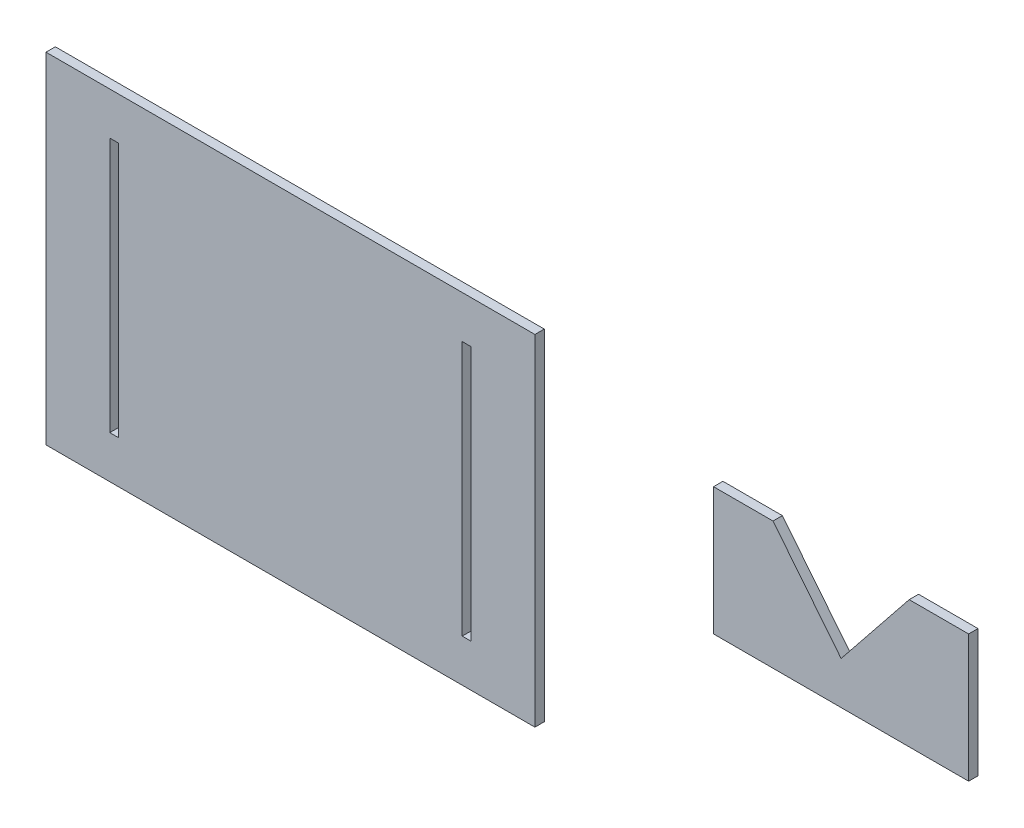
ISO-10303-21;
HEADER;
FILE_DESCRIPTION(('STEP AP214'),'2;1');
FILE_NAME('part.step','',(''),(''),'','','');
FILE_SCHEMA(('AUTOMOTIVE_DESIGN { 1 0 10303 214 1 1 1 1 }'));
ENDSEC;
DATA;
#1=APPLICATION_CONTEXT('core data for automotive mechanical design processes');
#2=APPLICATION_PROTOCOL_DEFINITION('international standard','automotive_design',2000,#1);
#3=PRODUCT_CONTEXT('',#1,'mechanical');
#4=PRODUCT('Part','Part','',(#3));
#5=PRODUCT_RELATED_PRODUCT_CATEGORY('part','',(#4));
#6=PRODUCT_DEFINITION_FORMATION('','',#4);
#7=PRODUCT_DEFINITION_CONTEXT('part definition',#1,'design');
#8=PRODUCT_DEFINITION('design','',#6,#7);
#9=PRODUCT_DEFINITION_SHAPE('','',#8);
#10=(LENGTH_UNIT() NAMED_UNIT(*) SI_UNIT(.MILLI.,.METRE.));
#11=(NAMED_UNIT(*) PLANE_ANGLE_UNIT() SI_UNIT($,.RADIAN.));
#12=(NAMED_UNIT(*) SI_UNIT($,.STERADIAN.) SOLID_ANGLE_UNIT());
#13=UNCERTAINTY_MEASURE_WITH_UNIT(LENGTH_MEASURE(1.E-05),#10,'distance_accuracy_value','');
#14=(GEOMETRIC_REPRESENTATION_CONTEXT(3) GLOBAL_UNCERTAINTY_ASSIGNED_CONTEXT((#13)) GLOBAL_UNIT_ASSIGNED_CONTEXT((#10,
#11,#12)) REPRESENTATION_CONTEXT('',''));
#15=CARTESIAN_POINT('',(0.,0.,0.));
#16=DIRECTION('',(0.,0.,1.));
#17=DIRECTION('',(1.,0.,0.));
#18=AXIS2_PLACEMENT_3D('',#15,#16,#17);
#19=CARTESIAN_POINT('',(159.51855249135,0.,2.2));
#20=DIRECTION('',(-1.,0.,0.));
#21=DIRECTION('',(0.,0.,1.));
#22=AXIS2_PLACEMENT_3D('',#19,#20,#21);
#23=PLANE('',#22);
#24=DIRECTION('',(0.,1.,0.));
#25=VECTOR('',#24,1.);
#26=CARTESIAN_POINT('',(159.51855249135,0.,0.));
#27=LINE('',#26,#25);
#28=CARTESIAN_POINT('',(159.51855249135,0.,0.));
#29=VERTEX_POINT('',#28);
#30=CARTESIAN_POINT('',(159.51855249135,30.,0.));
#31=VERTEX_POINT('',#30);
#32=EDGE_CURVE('E133',#29,#31,#27,.T.);
#33=ORIENTED_EDGE('',*,*,#32,.T.);
#34=DIRECTION('',(0.,0.,-1.));
#35=VECTOR('',#34,1.);
#36=CARTESIAN_POINT('',(159.51855249135,30.,2.2));
#37=LINE('',#36,#35);
#38=CARTESIAN_POINT('',(159.51855249135,30.,2.2));
#39=VERTEX_POINT('',#38);
#40=EDGE_CURVE('E12',#39,#31,#37,.T.);
#41=ORIENTED_EDGE('',*,*,#40,.F.);
#42=DIRECTION('',(0.,1.,0.));
#43=VECTOR('',#42,1.);
#44=CARTESIAN_POINT('',(159.51855249135,0.,2.2));
#45=LINE('',#44,#43);
#46=CARTESIAN_POINT('',(159.51855249135,0.,2.2));
#47=VERTEX_POINT('',#46);
#48=EDGE_CURVE('E145',#47,#39,#45,.T.);
#49=ORIENTED_EDGE('',*,*,#48,.F.);
#50=DIRECTION('',(0.,0.,-1.));
#51=VECTOR('',#50,1.);
#52=CARTESIAN_POINT('',(159.51855249135,0.,2.2));
#53=LINE('',#52,#51);
#54=EDGE_CURVE('E129',#47,#29,#53,.T.);
#55=ORIENTED_EDGE('',*,*,#54,.T.);
#56=EDGE_LOOP('',(#33,#41,#49,#55));
#57=FACE_BOUND('',#56,.T.);
#58=ADVANCED_FACE('F43',(#57),#23,.F.);
#59=CARTESIAN_POINT('',(159.51855249135,30.,2.2));
#60=DIRECTION('',(0.,-1.,0.));
#61=DIRECTION('',(1.,0.,0.));
#62=AXIS2_PLACEMENT_3D('',#59,#60,#61);
#63=PLANE('',#62);
#64=DIRECTION('',(-1.,0.,0.));
#65=VECTOR('',#64,1.);
#66=CARTESIAN_POINT('',(159.51855249135,30.,0.));
#67=LINE('',#66,#65);
#68=CARTESIAN_POINT('',(145.531367871858,30.,0.));
#69=VERTEX_POINT('',#68);
#70=EDGE_CURVE('E136',#31,#69,#67,.T.);
#71=ORIENTED_EDGE('',*,*,#70,.T.);
#72=DIRECTION('',(0.,0.,-1.));
#73=VECTOR('',#72,1.);
#74=CARTESIAN_POINT('',(145.531367871858,30.,2.2));
#75=LINE('',#74,#73);
#76=CARTESIAN_POINT('',(145.531367871858,30.,2.2));
#77=VERTEX_POINT('',#76);
#78=EDGE_CURVE('E51',#77,#69,#75,.T.);
#79=ORIENTED_EDGE('',*,*,#78,.F.);
#80=DIRECTION('',(-1.,0.,0.));
#81=VECTOR('',#80,1.);
#82=CARTESIAN_POINT('',(159.51855249135,30.,2.2));
#83=LINE('',#82,#81);
#84=EDGE_CURVE('E99',#39,#77,#83,.T.);
#85=ORIENTED_EDGE('',*,*,#84,.F.);
#86=ORIENTED_EDGE('',*,*,#40,.T.);
#87=EDGE_LOOP('',(#71,#79,#85,#86));
#88=FACE_BOUND('',#87,.T.);
#89=ADVANCED_FACE('F170',(#88),#63,.F.);
#90=CARTESIAN_POINT('',(129.51855249135,10.,2.2));
#91=DIRECTION('',(0.7806247497998,-0.625,0.));
#92=DIRECTION('',(0.625,0.7806247497998,0.));
#93=AXIS2_PLACEMENT_3D('',#90,#91,#92);
#94=PLANE('',#93);
#95=DIRECTION('',(-0.625,-0.7806247497998,0.));
#96=VECTOR('',#95,1.);
#97=CARTESIAN_POINT('',(129.51855249135,10.,0.));
#98=LINE('',#97,#96);
#99=CARTESIAN_POINT('',(129.51855249135,10.,0.));
#100=VERTEX_POINT('',#99);
#101=EDGE_CURVE('E138',#69,#100,#98,.T.);
#102=ORIENTED_EDGE('',*,*,#101,.T.);
#103=DIRECTION('',(0.,0.,-1.));
#104=VECTOR('',#103,1.);
#105=CARTESIAN_POINT('',(129.51855249135,10.,2.2));
#106=LINE('',#105,#104);
#107=CARTESIAN_POINT('',(129.51855249135,10.,2.2));
#108=VERTEX_POINT('',#107);
#109=EDGE_CURVE('E149',#108,#100,#106,.T.);
#110=ORIENTED_EDGE('',*,*,#109,.F.);
#111=DIRECTION('',(-0.625,-0.7806247497998,0.));
#112=VECTOR('',#111,1.);
#113=CARTESIAN_POINT('',(129.51855249135,10.,2.2));
#114=LINE('',#113,#112);
#115=EDGE_CURVE('E157',#77,#108,#114,.T.);
#116=ORIENTED_EDGE('',*,*,#115,.F.);
#117=ORIENTED_EDGE('',*,*,#78,.T.);
#118=EDGE_LOOP('',(#102,#110,#116,#117));
#119=FACE_BOUND('',#118,.T.);
#120=ADVANCED_FACE('F155',(#119),#94,.F.);
#121=CARTESIAN_POINT('',(113.505737110841,30.,2.2));
#122=DIRECTION('',(-0.7806247497998,-0.625,0.));
#123=DIRECTION('',(0.625,-0.7806247497998,0.));
#124=AXIS2_PLACEMENT_3D('',#121,#122,#123);
#125=PLANE('',#124);
#126=DIRECTION('',(-0.625,0.7806247497998,0.));
#127=VECTOR('',#126,1.);
#128=CARTESIAN_POINT('',(113.505737110841,30.,0.));
#129=LINE('',#128,#127);
#130=CARTESIAN_POINT('',(113.505737110841,30.,0.));
#131=VERTEX_POINT('',#130);
#132=EDGE_CURVE('E140',#100,#131,#129,.T.);
#133=ORIENTED_EDGE('',*,*,#132,.T.);
#134=DIRECTION('',(0.,0.,-1.));
#135=VECTOR('',#134,1.);
#136=CARTESIAN_POINT('',(113.505737110841,30.,2.2));
#137=LINE('',#136,#135);
#138=CARTESIAN_POINT('',(113.505737110841,30.,2.2));
#139=VERTEX_POINT('',#138);
#140=EDGE_CURVE('E124',#139,#131,#137,.T.);
#141=ORIENTED_EDGE('',*,*,#140,.F.);
#142=DIRECTION('',(-0.625,0.7806247497998,0.));
#143=VECTOR('',#142,1.);
#144=CARTESIAN_POINT('',(113.505737110841,30.,2.2));
#145=LINE('',#144,#143);
#146=EDGE_CURVE('E115',#108,#139,#145,.T.);
#147=ORIENTED_EDGE('',*,*,#146,.F.);
#148=ORIENTED_EDGE('',*,*,#109,.T.);
#149=EDGE_LOOP('',(#133,#141,#147,#148));
#150=FACE_BOUND('',#149,.T.);
#151=ADVANCED_FACE('F163',(#150),#125,.F.);
#152=CARTESIAN_POINT('',(113.505737110841,30.,2.2));
#153=DIRECTION('',(0.,-1.,0.));
#154=DIRECTION('',(1.,0.,0.));
#155=AXIS2_PLACEMENT_3D('',#152,#153,#154);
#156=PLANE('',#155);
#157=DIRECTION('',(-1.,0.,0.));
#158=VECTOR('',#157,1.);
#159=CARTESIAN_POINT('',(113.505737110841,30.,0.));
#160=LINE('',#159,#158);
#161=CARTESIAN_POINT('',(99.5185524913497,30.,0.));
#162=VERTEX_POINT('',#161);
#163=EDGE_CURVE('E123',#131,#162,#160,.T.);
#164=ORIENTED_EDGE('',*,*,#163,.T.);
#165=DIRECTION('',(0.,0.,-1.));
#166=VECTOR('',#165,1.);
#167=CARTESIAN_POINT('',(99.5185524913497,30.,2.2));
#168=LINE('',#167,#166);
#169=CARTESIAN_POINT('',(99.5185524913497,30.,2.2));
#170=VERTEX_POINT('',#169);
#171=EDGE_CURVE('E120',#170,#162,#168,.T.);
#172=ORIENTED_EDGE('',*,*,#171,.F.);
#173=DIRECTION('',(-1.,0.,0.));
#174=VECTOR('',#173,1.);
#175=CARTESIAN_POINT('',(113.505737110841,30.,2.2));
#176=LINE('',#175,#174);
#177=EDGE_CURVE('E109',#139,#170,#176,.T.);
#178=ORIENTED_EDGE('',*,*,#177,.F.);
#179=ORIENTED_EDGE('',*,*,#140,.T.);
#180=EDGE_LOOP('',(#164,#172,#178,#179));
#181=FACE_BOUND('',#180,.T.);
#182=ADVANCED_FACE('F121',(#181),#156,.F.);
#183=CARTESIAN_POINT('',(99.5185524913497,0.,2.2));
#184=DIRECTION('',(1.,0.,0.));
#185=DIRECTION('',(0.,0.,-1.));
#186=AXIS2_PLACEMENT_3D('',#183,#184,#185);
#187=PLANE('',#186);
#188=DIRECTION('',(0.,-1.,0.));
#189=VECTOR('',#188,1.);
#190=CARTESIAN_POINT('',(99.5185524913497,0.,0.));
#191=LINE('',#190,#189);
#192=CARTESIAN_POINT('',(99.5185524913497,0.,0.));
#193=VERTEX_POINT('',#192);
#194=EDGE_CURVE('E85',#162,#193,#191,.T.);
#195=ORIENTED_EDGE('',*,*,#194,.T.);
#196=DIRECTION('',(0.,0.,-1.));
#197=VECTOR('',#196,1.);
#198=CARTESIAN_POINT('',(99.5185524913497,0.,2.2));
#199=LINE('',#198,#197);
#200=CARTESIAN_POINT('',(99.5185524913497,0.,2.2));
#201=VERTEX_POINT('',#200);
#202=EDGE_CURVE('E125',#201,#193,#199,.T.);
#203=ORIENTED_EDGE('',*,*,#202,.F.);
#204=DIRECTION('',(0.,-1.,0.));
#205=VECTOR('',#204,1.);
#206=CARTESIAN_POINT('',(99.5185524913497,0.,2.2));
#207=LINE('',#206,#205);
#208=EDGE_CURVE('E113',#170,#201,#207,.T.);
#209=ORIENTED_EDGE('',*,*,#208,.F.);
#210=ORIENTED_EDGE('',*,*,#171,.T.);
#211=EDGE_LOOP('',(#195,#203,#209,#210));
#212=FACE_BOUND('',#211,.T.);
#213=ADVANCED_FACE('F127',(#212),#187,.F.);
#214=CARTESIAN_POINT('',(159.51855249135,0.,2.2));
#215=DIRECTION('',(0.,1.,0.));
#216=DIRECTION('',(-1.,0.,0.));
#217=AXIS2_PLACEMENT_3D('',#214,#215,#216);
#218=PLANE('',#217);
#219=DIRECTION('',(1.,0.,0.));
#220=VECTOR('',#219,1.);
#221=CARTESIAN_POINT('',(159.51855249135,0.,0.));
#222=LINE('',#221,#220);
#223=EDGE_CURVE('E91',#193,#29,#222,.T.);
#224=ORIENTED_EDGE('',*,*,#223,.T.);
#225=ORIENTED_EDGE('',*,*,#54,.F.);
#226=DIRECTION('',(1.,0.,0.));
#227=VECTOR('',#226,1.);
#228=CARTESIAN_POINT('',(159.51855249135,0.,2.2));
#229=LINE('',#228,#227);
#230=EDGE_CURVE('E59',#201,#47,#229,.T.);
#231=ORIENTED_EDGE('',*,*,#230,.F.);
#232=ORIENTED_EDGE('',*,*,#202,.T.);
#233=EDGE_LOOP('',(#224,#225,#231,#232));
#234=FACE_BOUND('',#233,.T.);
#235=ADVANCED_FACE('F184',(#234),#218,.F.);
#236=CARTESIAN_POINT('',(0.,0.,2.2));
#237=DIRECTION('',(0.,0.,1.));
#238=DIRECTION('',(1.,0.,0.));
#239=AXIS2_PLACEMENT_3D('',#236,#237,#238);
#240=PLANE('',#239);
#241=ORIENTED_EDGE('',*,*,#48,.T.);
#242=ORIENTED_EDGE('',*,*,#84,.T.);
#243=ORIENTED_EDGE('',*,*,#115,.T.);
#244=ORIENTED_EDGE('',*,*,#146,.T.);
#245=ORIENTED_EDGE('',*,*,#177,.T.);
#246=ORIENTED_EDGE('',*,*,#208,.T.);
#247=ORIENTED_EDGE('',*,*,#230,.T.);
#248=EDGE_LOOP('',(#241,#242,#243,#244,#245,#246,#247));
#249=FACE_BOUND('',#248,.T.);
#250=ADVANCED_FACE('F111',(#249),#240,.T.);
#251=CARTESIAN_POINT('',(0.,0.,0.));
#252=DIRECTION('',(0.,0.,1.));
#253=DIRECTION('',(1.,0.,0.));
#254=AXIS2_PLACEMENT_3D('',#251,#252,#253);
#255=PLANE('',#254);
#256=ORIENTED_EDGE('',*,*,#32,.F.);
#257=ORIENTED_EDGE('',*,*,#223,.F.);
#258=ORIENTED_EDGE('',*,*,#194,.F.);
#259=ORIENTED_EDGE('',*,*,#163,.F.);
#260=ORIENTED_EDGE('',*,*,#132,.F.);
#261=ORIENTED_EDGE('',*,*,#101,.F.);
#262=ORIENTED_EDGE('',*,*,#70,.F.);
#263=EDGE_LOOP('',(#256,#257,#258,#259,#260,#261,#262));
#264=FACE_BOUND('',#263,.T.);
#265=ADVANCED_FACE('F161',(#264),#255,.F.);
#266=CLOSED_SHELL('',(#58,#89,#120,#151,#182,#213,#235,#250,#265));
#267=MANIFOLD_SOLID_BREP('B2',#266);
#268=CARTESIAN_POINT('',(0.,0.,2.2));
#269=DIRECTION('',(0.,0.,-1.));
#270=DIRECTION('',(-1.,0.,0.));
#271=AXIS2_PLACEMENT_3D('',#268,#269,#270);
#272=PLANE('',#271);
#273=DIRECTION('',(0.,1.,0.));
#274=VECTOR('',#273,1.);
#275=CARTESIAN_POINT('',(42.5,-30.,2.2));
#276=LINE('',#275,#274);
#277=CARTESIAN_POINT('',(42.5,-30.,2.2));
#278=VERTEX_POINT('',#277);
#279=CARTESIAN_POINT('',(42.5,30.,2.2));
#280=VERTEX_POINT('',#279);
#281=EDGE_CURVE('E370',#278,#280,#276,.T.);
#282=ORIENTED_EDGE('',*,*,#281,.F.);
#283=DIRECTION('',(1.,0.,0.));
#284=VECTOR('',#283,1.);
#285=CARTESIAN_POINT('',(40.4,-30.,2.2));
#286=LINE('',#285,#284);
#287=CARTESIAN_POINT('',(40.4,-30.,2.2));
#288=VERTEX_POINT('',#287);
#289=EDGE_CURVE('E378',#288,#278,#286,.T.);
#290=ORIENTED_EDGE('',*,*,#289,.F.);
#291=DIRECTION('',(0.,-1.,0.));
#292=VECTOR('',#291,1.);
#293=CARTESIAN_POINT('',(40.4,-30.,2.2));
#294=LINE('',#293,#292);
#295=CARTESIAN_POINT('',(40.4,30.,2.2));
#296=VERTEX_POINT('',#295);
#297=EDGE_CURVE('E375',#296,#288,#294,.T.);
#298=ORIENTED_EDGE('',*,*,#297,.F.);
#299=DIRECTION('',(-1.,0.,0.));
#300=VECTOR('',#299,1.);
#301=CARTESIAN_POINT('',(40.4,30.,2.2));
#302=LINE('',#301,#300);
#303=EDGE_CURVE('E372',#280,#296,#302,.T.);
#304=ORIENTED_EDGE('',*,*,#303,.F.);
#305=EDGE_LOOP('',(#282,#290,#298,#304));
#306=FACE_BOUND('',#305,.T.);
#307=DIRECTION('',(0.,1.,0.));
#308=VECTOR('',#307,1.);
#309=CARTESIAN_POINT('',(57.5,-40.,2.2));
#310=LINE('',#309,#308);
#311=CARTESIAN_POINT('',(57.5,-40.,2.2));
#312=VERTEX_POINT('',#311);
#313=CARTESIAN_POINT('',(57.5,40.,2.2));
#314=VERTEX_POINT('',#313);
#315=EDGE_CURVE('E401',#312,#314,#310,.T.);
#316=ORIENTED_EDGE('',*,*,#315,.T.);
#317=DIRECTION('',(-1.,0.,0.));
#318=VECTOR('',#317,1.);
#319=CARTESIAN_POINT('',(-57.5,40.,2.2));
#320=LINE('',#319,#318);
#321=CARTESIAN_POINT('',(-57.5,40.,2.2));
#322=VERTEX_POINT('',#321);
#323=EDGE_CURVE('E404',#314,#322,#320,.T.);
#324=ORIENTED_EDGE('',*,*,#323,.T.);
#325=DIRECTION('',(0.,-1.,0.));
#326=VECTOR('',#325,1.);
#327=CARTESIAN_POINT('',(-57.5,-40.,2.2));
#328=LINE('',#327,#326);
#329=CARTESIAN_POINT('',(-57.5,-40.,2.2));
#330=VERTEX_POINT('',#329);
#331=EDGE_CURVE('E407',#322,#330,#328,.T.);
#332=ORIENTED_EDGE('',*,*,#331,.T.);
#333=DIRECTION('',(1.,0.,0.));
#334=VECTOR('',#333,1.);
#335=CARTESIAN_POINT('',(-57.5,-40.,2.2));
#336=LINE('',#335,#334);
#337=EDGE_CURVE('E409',#330,#312,#336,.T.);
#338=ORIENTED_EDGE('',*,*,#337,.T.);
#339=EDGE_LOOP('',(#316,#324,#332,#338));
#340=FACE_BOUND('',#339,.T.);
#341=DIRECTION('',(0.,1.,0.));
#342=VECTOR('',#341,1.);
#343=CARTESIAN_POINT('',(-40.4,-30.,2.2));
#344=LINE('',#343,#342);
#345=CARTESIAN_POINT('',(-40.4,-30.,2.2));
#346=VERTEX_POINT('',#345);
#347=CARTESIAN_POINT('',(-40.4,30.,2.2));
#348=VERTEX_POINT('',#347);
#349=EDGE_CURVE('E334',#346,#348,#344,.T.);
#350=ORIENTED_EDGE('',*,*,#349,.F.);
#351=DIRECTION('',(1.,0.,0.));
#352=VECTOR('',#351,1.);
#353=CARTESIAN_POINT('',(-40.4,-30.,2.2));
#354=LINE('',#353,#352);
#355=CARTESIAN_POINT('',(-42.5,-30.,2.2));
#356=VERTEX_POINT('',#355);
#357=EDGE_CURVE('E356',#356,#346,#354,.T.);
#358=ORIENTED_EDGE('',*,*,#357,.F.);
#359=DIRECTION('',(0.,-1.,0.));
#360=VECTOR('',#359,1.);
#361=CARTESIAN_POINT('',(-42.5,-30.,2.2));
#362=LINE('',#361,#360);
#363=CARTESIAN_POINT('',(-42.5,30.,2.2));
#364=VERTEX_POINT('',#363);
#365=EDGE_CURVE('E354',#364,#356,#362,.T.);
#366=ORIENTED_EDGE('',*,*,#365,.F.);
#367=DIRECTION('',(-1.,0.,0.));
#368=VECTOR('',#367,1.);
#369=CARTESIAN_POINT('',(-40.4,30.,2.2));
#370=LINE('',#369,#368);
#371=EDGE_CURVE('E342',#348,#364,#370,.T.);
#372=ORIENTED_EDGE('',*,*,#371,.F.);
#373=EDGE_LOOP('',(#350,#358,#366,#372));
#374=FACE_BOUND('',#373,.T.);
#375=ADVANCED_FACE('F245',(#306,#340,#374),#272,.F.);
#376=CARTESIAN_POINT('',(0.,0.,0.));
#377=DIRECTION('',(0.,0.,-1.));
#378=DIRECTION('',(-1.,0.,0.));
#379=AXIS2_PLACEMENT_3D('',#376,#377,#378);
#380=PLANE('',#379);
#381=DIRECTION('',(0.,1.,0.));
#382=VECTOR('',#381,1.);
#383=CARTESIAN_POINT('',(57.5,-40.,0.));
#384=LINE('',#383,#382);
#385=CARTESIAN_POINT('',(57.5,-40.,0.));
#386=VERTEX_POINT('',#385);
#387=CARTESIAN_POINT('',(57.5,40.,0.));
#388=VERTEX_POINT('',#387);
#389=EDGE_CURVE('E400',#386,#388,#384,.T.);
#390=ORIENTED_EDGE('',*,*,#389,.F.);
#391=DIRECTION('',(1.,0.,0.));
#392=VECTOR('',#391,1.);
#393=CARTESIAN_POINT('',(-57.5,-40.,0.));
#394=LINE('',#393,#392);
#395=CARTESIAN_POINT('',(-57.5,-40.,0.));
#396=VERTEX_POINT('',#395);
#397=EDGE_CURVE('E405',#396,#386,#394,.T.);
#398=ORIENTED_EDGE('',*,*,#397,.F.);
#399=DIRECTION('',(0.,-1.,0.));
#400=VECTOR('',#399,1.);
#401=CARTESIAN_POINT('',(-57.5,-40.,0.));
#402=LINE('',#401,#400);
#403=CARTESIAN_POINT('',(-57.5,40.,0.));
#404=VERTEX_POINT('',#403);
#405=EDGE_CURVE('E416',#404,#396,#402,.T.);
#406=ORIENTED_EDGE('',*,*,#405,.F.);
#407=DIRECTION('',(-1.,0.,0.));
#408=VECTOR('',#407,1.);
#409=CARTESIAN_POINT('',(-57.5,40.,0.));
#410=LINE('',#409,#408);
#411=EDGE_CURVE('E414',#388,#404,#410,.T.);
#412=ORIENTED_EDGE('',*,*,#411,.F.);
#413=EDGE_LOOP('',(#390,#398,#406,#412));
#414=FACE_BOUND('',#413,.T.);
#415=DIRECTION('',(1.,0.,0.));
#416=VECTOR('',#415,1.);
#417=CARTESIAN_POINT('',(40.4,-30.,0.));
#418=LINE('',#417,#416);
#419=CARTESIAN_POINT('',(40.4,-30.,0.));
#420=VERTEX_POINT('',#419);
#421=CARTESIAN_POINT('',(42.5,-30.,0.));
#422=VERTEX_POINT('',#421);
#423=EDGE_CURVE('E373',#420,#422,#418,.T.);
#424=ORIENTED_EDGE('',*,*,#423,.T.);
#425=DIRECTION('',(0.,1.,0.));
#426=VECTOR('',#425,1.);
#427=CARTESIAN_POINT('',(42.5,-30.,0.));
#428=LINE('',#427,#426);
#429=CARTESIAN_POINT('',(42.5,30.,0.));
#430=VERTEX_POINT('',#429);
#431=EDGE_CURVE('E350',#422,#430,#428,.T.);
#432=ORIENTED_EDGE('',*,*,#431,.T.);
#433=DIRECTION('',(-1.,0.,0.));
#434=VECTOR('',#433,1.);
#435=CARTESIAN_POINT('',(40.4,30.,0.));
#436=LINE('',#435,#434);
#437=CARTESIAN_POINT('',(40.4,30.,0.));
#438=VERTEX_POINT('',#437);
#439=EDGE_CURVE('E383',#430,#438,#436,.T.);
#440=ORIENTED_EDGE('',*,*,#439,.T.);
#441=DIRECTION('',(0.,-1.,0.));
#442=VECTOR('',#441,1.);
#443=CARTESIAN_POINT('',(40.4,-30.,0.));
#444=LINE('',#443,#442);
#445=EDGE_CURVE('E386',#438,#420,#444,.T.);
#446=ORIENTED_EDGE('',*,*,#445,.T.);
#447=EDGE_LOOP('',(#424,#432,#440,#446));
#448=FACE_BOUND('',#447,.T.);
#449=DIRECTION('',(1.,0.,0.));
#450=VECTOR('',#449,1.);
#451=CARTESIAN_POINT('',(-40.4,-30.,0.));
#452=LINE('',#451,#450);
#453=CARTESIAN_POINT('',(-42.5,-30.,0.));
#454=VERTEX_POINT('',#453);
#455=CARTESIAN_POINT('',(-40.4,-30.,0.));
#456=VERTEX_POINT('',#455);
#457=EDGE_CURVE('E343',#454,#456,#452,.T.);
#458=ORIENTED_EDGE('',*,*,#457,.T.);
#459=DIRECTION('',(0.,1.,0.));
#460=VECTOR('',#459,1.);
#461=CARTESIAN_POINT('',(-40.4,-30.,0.));
#462=LINE('',#461,#460);
#463=CARTESIAN_POINT('',(-40.4,30.,0.));
#464=VERTEX_POINT('',#463);
#465=EDGE_CURVE('E268',#456,#464,#462,.T.);
#466=ORIENTED_EDGE('',*,*,#465,.T.);
#467=DIRECTION('',(-1.,0.,0.));
#468=VECTOR('',#467,1.);
#469=CARTESIAN_POINT('',(-40.4,30.,0.));
#470=LINE('',#469,#468);
#471=CARTESIAN_POINT('',(-42.5,30.,0.));
#472=VERTEX_POINT('',#471);
#473=EDGE_CURVE('E349',#464,#472,#470,.T.);
#474=ORIENTED_EDGE('',*,*,#473,.T.);
#475=DIRECTION('',(0.,-1.,0.));
#476=VECTOR('',#475,1.);
#477=CARTESIAN_POINT('',(-42.5,-30.,0.));
#478=LINE('',#477,#476);
#479=EDGE_CURVE('E362',#472,#454,#478,.T.);
#480=ORIENTED_EDGE('',*,*,#479,.T.);
#481=EDGE_LOOP('',(#458,#466,#474,#480));
#482=FACE_BOUND('',#481,.T.);
#483=ADVANCED_FACE('F434',(#414,#448,#482),#380,.T.);
#484=CARTESIAN_POINT('',(57.5,-40.,2.2));
#485=DIRECTION('',(-1.,0.,0.));
#486=DIRECTION('',(0.,0.,1.));
#487=AXIS2_PLACEMENT_3D('',#484,#485,#486);
#488=PLANE('',#487);
#489=ORIENTED_EDGE('',*,*,#389,.T.);
#490=DIRECTION('',(0.,0.,-1.));
#491=VECTOR('',#490,1.);
#492=CARTESIAN_POINT('',(57.5,40.,2.2));
#493=LINE('',#492,#491);
#494=EDGE_CURVE('E41',#314,#388,#493,.T.);
#495=ORIENTED_EDGE('',*,*,#494,.F.);
#496=ORIENTED_EDGE('',*,*,#315,.F.);
#497=DIRECTION('',(0.,0.,-1.));
#498=VECTOR('',#497,1.);
#499=CARTESIAN_POINT('',(57.5,-40.,2.2));
#500=LINE('',#499,#498);
#501=EDGE_CURVE('E411',#312,#386,#500,.T.);
#502=ORIENTED_EDGE('',*,*,#501,.T.);
#503=EDGE_LOOP('',(#489,#495,#496,#502));
#504=FACE_BOUND('',#503,.T.);
#505=ADVANCED_FACE('F247',(#504),#488,.F.);
#506=CARTESIAN_POINT('',(-57.5,40.,2.2));
#507=DIRECTION('',(0.,-1.,0.));
#508=DIRECTION('',(0.,0.,-1.));
#509=AXIS2_PLACEMENT_3D('',#506,#507,#508);
#510=PLANE('',#509);
#511=ORIENTED_EDGE('',*,*,#411,.T.);
#512=DIRECTION('',(0.,0.,-1.));
#513=VECTOR('',#512,1.);
#514=CARTESIAN_POINT('',(-57.5,40.,2.2));
#515=LINE('',#514,#513);
#516=EDGE_CURVE('E253',#322,#404,#515,.T.);
#517=ORIENTED_EDGE('',*,*,#516,.F.);
#518=ORIENTED_EDGE('',*,*,#323,.F.);
#519=ORIENTED_EDGE('',*,*,#494,.T.);
#520=EDGE_LOOP('',(#511,#517,#518,#519));
#521=FACE_BOUND('',#520,.T.);
#522=ADVANCED_FACE('F444',(#521),#510,.F.);
#523=CARTESIAN_POINT('',(-57.5,-40.,2.2));
#524=DIRECTION('',(1.,0.,0.));
#525=DIRECTION('',(0.,0.,-1.));
#526=AXIS2_PLACEMENT_3D('',#523,#524,#525);
#527=PLANE('',#526);
#528=ORIENTED_EDGE('',*,*,#405,.T.);
#529=DIRECTION('',(0.,0.,-1.));
#530=VECTOR('',#529,1.);
#531=CARTESIAN_POINT('',(-57.5,-40.,2.2));
#532=LINE('',#531,#530);
#533=EDGE_CURVE('E421',#330,#396,#532,.T.);
#534=ORIENTED_EDGE('',*,*,#533,.F.);
#535=ORIENTED_EDGE('',*,*,#331,.F.);
#536=ORIENTED_EDGE('',*,*,#516,.T.);
#537=EDGE_LOOP('',(#528,#534,#535,#536));
#538=FACE_BOUND('',#537,.T.);
#539=ADVANCED_FACE('F428',(#538),#527,.F.);
#540=CARTESIAN_POINT('',(-57.5,-40.,2.2));
#541=DIRECTION('',(0.,1.,0.));
#542=DIRECTION('',(0.,0.,1.));
#543=AXIS2_PLACEMENT_3D('',#540,#541,#542);
#544=PLANE('',#543);
#545=ORIENTED_EDGE('',*,*,#397,.T.);
#546=ORIENTED_EDGE('',*,*,#501,.F.);
#547=ORIENTED_EDGE('',*,*,#337,.F.);
#548=ORIENTED_EDGE('',*,*,#533,.T.);
#549=EDGE_LOOP('',(#545,#546,#547,#548));
#550=FACE_BOUND('',#549,.T.);
#551=ADVANCED_FACE('F438',(#550),#544,.F.);
#552=CARTESIAN_POINT('',(42.5,-30.,2.2));
#553=DIRECTION('',(-1.,0.,0.));
#554=DIRECTION('',(0.,0.,1.));
#555=AXIS2_PLACEMENT_3D('',#552,#553,#554);
#556=PLANE('',#555);
#557=ORIENTED_EDGE('',*,*,#431,.F.);
#558=DIRECTION('',(0.,0.,-1.));
#559=VECTOR('',#558,1.);
#560=CARTESIAN_POINT('',(42.5,-30.,2.2));
#561=LINE('',#560,#559);
#562=EDGE_CURVE('E380',#278,#422,#561,.T.);
#563=ORIENTED_EDGE('',*,*,#562,.F.);
#564=ORIENTED_EDGE('',*,*,#281,.T.);
#565=DIRECTION('',(0.,0.,-1.));
#566=VECTOR('',#565,1.);
#567=CARTESIAN_POINT('',(42.5,30.,2.2));
#568=LINE('',#567,#566);
#569=EDGE_CURVE('E397',#280,#430,#568,.T.);
#570=ORIENTED_EDGE('',*,*,#569,.T.);
#571=EDGE_LOOP('',(#557,#563,#564,#570));
#572=FACE_BOUND('',#571,.T.);
#573=ADVANCED_FACE('F460',(#572),#556,.T.);
#574=CARTESIAN_POINT('',(40.4,30.,2.2));
#575=DIRECTION('',(0.,-1.,0.));
#576=DIRECTION('',(0.,0.,-1.));
#577=AXIS2_PLACEMENT_3D('',#574,#575,#576);
#578=PLANE('',#577);
#579=ORIENTED_EDGE('',*,*,#439,.F.);
#580=ORIENTED_EDGE('',*,*,#569,.F.);
#581=ORIENTED_EDGE('',*,*,#303,.T.);
#582=DIRECTION('',(0.,0.,-1.));
#583=VECTOR('',#582,1.);
#584=CARTESIAN_POINT('',(40.4,30.,2.2));
#585=LINE('',#584,#583);
#586=EDGE_CURVE('E395',#296,#438,#585,.T.);
#587=ORIENTED_EDGE('',*,*,#586,.T.);
#588=EDGE_LOOP('',(#579,#580,#581,#587));
#589=FACE_BOUND('',#588,.T.);
#590=ADVANCED_FACE('F467',(#589),#578,.T.);
#591=CARTESIAN_POINT('',(40.4,-30.,2.2));
#592=DIRECTION('',(1.,0.,0.));
#593=DIRECTION('',(0.,0.,-1.));
#594=AXIS2_PLACEMENT_3D('',#591,#592,#593);
#595=PLANE('',#594);
#596=ORIENTED_EDGE('',*,*,#445,.F.);
#597=ORIENTED_EDGE('',*,*,#586,.F.);
#598=ORIENTED_EDGE('',*,*,#297,.T.);
#599=DIRECTION('',(0.,0.,-1.));
#600=VECTOR('',#599,1.);
#601=CARTESIAN_POINT('',(40.4,-30.,2.2));
#602=LINE('',#601,#600);
#603=EDGE_CURVE('E393',#288,#420,#602,.T.);
#604=ORIENTED_EDGE('',*,*,#603,.T.);
#605=EDGE_LOOP('',(#596,#597,#598,#604));
#606=FACE_BOUND('',#605,.T.);
#607=ADVANCED_FACE('F472',(#606),#595,.T.);
#608=CARTESIAN_POINT('',(40.4,-30.,2.2));
#609=DIRECTION('',(0.,1.,0.));
#610=DIRECTION('',(0.,0.,1.));
#611=AXIS2_PLACEMENT_3D('',#608,#609,#610);
#612=PLANE('',#611);
#613=ORIENTED_EDGE('',*,*,#423,.F.);
#614=ORIENTED_EDGE('',*,*,#603,.F.);
#615=ORIENTED_EDGE('',*,*,#289,.T.);
#616=ORIENTED_EDGE('',*,*,#562,.T.);
#617=EDGE_LOOP('',(#613,#614,#615,#616));
#618=FACE_BOUND('',#617,.T.);
#619=ADVANCED_FACE('F478',(#618),#612,.T.);
#620=CARTESIAN_POINT('',(-40.4,-30.,2.2));
#621=DIRECTION('',(-1.,0.,0.));
#622=DIRECTION('',(0.,-1.,0.));
#623=AXIS2_PLACEMENT_3D('',#620,#621,#622);
#624=PLANE('',#623);
#625=ORIENTED_EDGE('',*,*,#465,.F.);
#626=DIRECTION('',(0.,0.,-1.));
#627=VECTOR('',#626,1.);
#628=CARTESIAN_POINT('',(-40.4,-30.,2.2));
#629=LINE('',#628,#627);
#630=EDGE_CURVE('E338',#346,#456,#629,.T.);
#631=ORIENTED_EDGE('',*,*,#630,.F.);
#632=ORIENTED_EDGE('',*,*,#349,.T.);
#633=DIRECTION('',(0.,0.,-1.));
#634=VECTOR('',#633,1.);
#635=CARTESIAN_POINT('',(-40.4,30.,2.2));
#636=LINE('',#635,#634);
#637=EDGE_CURVE('E337',#348,#464,#636,.T.);
#638=ORIENTED_EDGE('',*,*,#637,.T.);
#639=EDGE_LOOP('',(#625,#631,#632,#638));
#640=FACE_BOUND('',#639,.T.);
#641=ADVANCED_FACE('F336',(#640),#624,.T.);
#642=CARTESIAN_POINT('',(-40.4,30.,2.2));
#643=DIRECTION('',(0.,-1.,0.));
#644=DIRECTION('',(0.,0.,-1.));
#645=AXIS2_PLACEMENT_3D('',#642,#643,#644);
#646=PLANE('',#645);
#647=ORIENTED_EDGE('',*,*,#473,.F.);
#648=ORIENTED_EDGE('',*,*,#637,.F.);
#649=ORIENTED_EDGE('',*,*,#371,.T.);
#650=DIRECTION('',(0.,0.,-1.));
#651=VECTOR('',#650,1.);
#652=CARTESIAN_POINT('',(-42.5,30.,2.2));
#653=LINE('',#652,#651);
#654=EDGE_CURVE('E351',#364,#472,#653,.T.);
#655=ORIENTED_EDGE('',*,*,#654,.T.);
#656=EDGE_LOOP('',(#647,#648,#649,#655));
#657=FACE_BOUND('',#656,.T.);
#658=ADVANCED_FACE('F346',(#657),#646,.T.);
#659=CARTESIAN_POINT('',(-42.5,-30.,2.2));
#660=DIRECTION('',(1.,0.,0.));
#661=DIRECTION('',(0.,1.,0.));
#662=AXIS2_PLACEMENT_3D('',#659,#660,#661);
#663=PLANE('',#662);
#664=ORIENTED_EDGE('',*,*,#479,.F.);
#665=ORIENTED_EDGE('',*,*,#654,.F.);
#666=ORIENTED_EDGE('',*,*,#365,.T.);
#667=DIRECTION('',(0.,0.,-1.));
#668=VECTOR('',#667,1.);
#669=CARTESIAN_POINT('',(-42.5,-30.,2.2));
#670=LINE('',#669,#668);
#671=EDGE_CURVE('E260',#356,#454,#670,.T.);
#672=ORIENTED_EDGE('',*,*,#671,.T.);
#673=EDGE_LOOP('',(#664,#665,#666,#672));
#674=FACE_BOUND('',#673,.T.);
#675=ADVANCED_FACE('F497',(#674),#663,.T.);
#676=CARTESIAN_POINT('',(-40.4,-30.,2.2));
#677=DIRECTION('',(0.,1.,0.));
#678=DIRECTION('',(0.,0.,1.));
#679=AXIS2_PLACEMENT_3D('',#676,#677,#678);
#680=PLANE('',#679);
#681=ORIENTED_EDGE('',*,*,#457,.F.);
#682=ORIENTED_EDGE('',*,*,#671,.F.);
#683=ORIENTED_EDGE('',*,*,#357,.T.);
#684=ORIENTED_EDGE('',*,*,#630,.T.);
#685=EDGE_LOOP('',(#681,#682,#683,#684));
#686=FACE_BOUND('',#685,.T.);
#687=ADVANCED_FACE('F500',(#686),#680,.T.);
#688=CLOSED_SHELL('',(#375,#483,#505,#522,#539,#551,#573,#590,#607,#619,#641,#658,#675,#687));
#689=MANIFOLD_SOLID_BREP('B6',#688);
#690=ADVANCED_BREP_SHAPE_REPRESENTATION('',(#18,#267,#689),#14);
#691=SHAPE_DEFINITION_REPRESENTATION(#9,#690);
ENDSEC;
END-ISO-10303-21;
